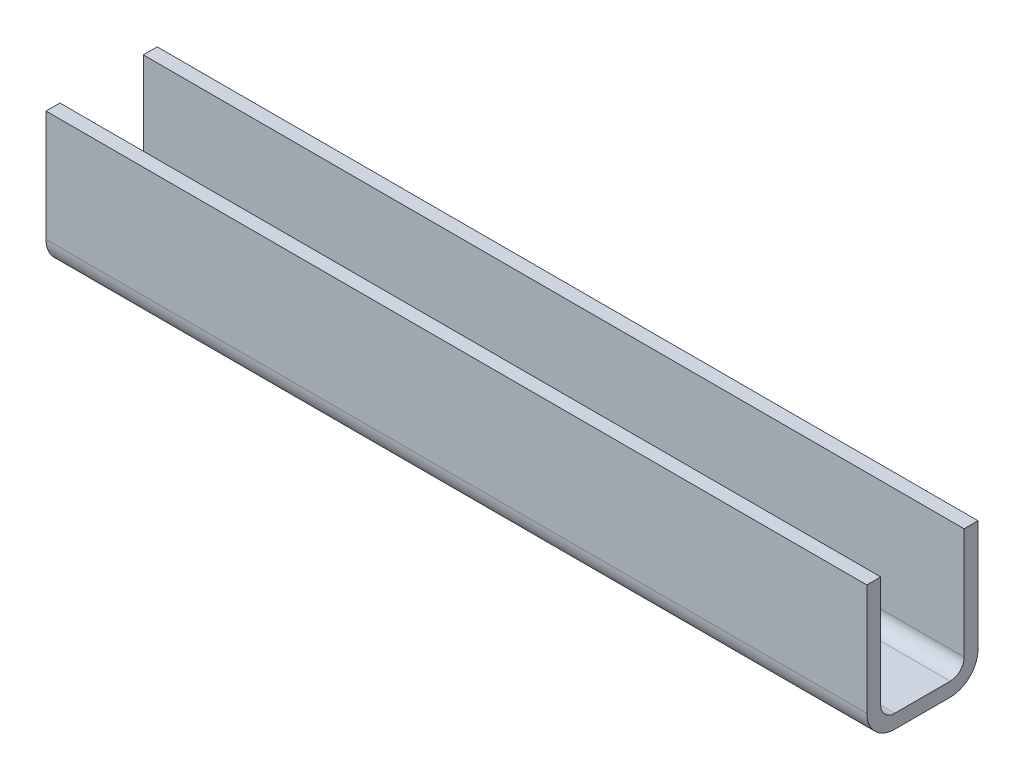
ISO-10303-21;
HEADER;
FILE_DESCRIPTION(('STEP AP214'),'2;1');
FILE_NAME('part.step','',(''),(''),'','','');
FILE_SCHEMA(('AUTOMOTIVE_DESIGN { 1 0 10303 214 1 1 1 1 }'));
ENDSEC;
DATA;
#1=APPLICATION_CONTEXT('core data for automotive mechanical design processes');
#2=APPLICATION_PROTOCOL_DEFINITION('international standard','automotive_design',2000,#1);
#3=PRODUCT_CONTEXT('',#1,'mechanical');
#4=PRODUCT('Part','Part','',(#3));
#5=PRODUCT_RELATED_PRODUCT_CATEGORY('part','',(#4));
#6=PRODUCT_DEFINITION_FORMATION('','',#4);
#7=PRODUCT_DEFINITION_CONTEXT('part definition',#1,'design');
#8=PRODUCT_DEFINITION('design','',#6,#7);
#9=PRODUCT_DEFINITION_SHAPE('','',#8);
#10=(LENGTH_UNIT() NAMED_UNIT(*) SI_UNIT(.MILLI.,.METRE.));
#11=(NAMED_UNIT(*) PLANE_ANGLE_UNIT() SI_UNIT($,.RADIAN.));
#12=(NAMED_UNIT(*) SI_UNIT($,.STERADIAN.) SOLID_ANGLE_UNIT());
#13=UNCERTAINTY_MEASURE_WITH_UNIT(LENGTH_MEASURE(1.E-05),#10,'distance_accuracy_value','');
#14=(GEOMETRIC_REPRESENTATION_CONTEXT(3) GLOBAL_UNCERTAINTY_ASSIGNED_CONTEXT((#13)) GLOBAL_UNIT_ASSIGNED_CONTEXT((#10,
#11,#12)) REPRESENTATION_CONTEXT('',''));
#15=CARTESIAN_POINT('',(0.,0.,0.));
#16=DIRECTION('',(0.,0.,1.));
#17=DIRECTION('',(1.,0.,0.));
#18=AXIS2_PLACEMENT_3D('',#15,#16,#17);
#19=CARTESIAN_POINT('',(375.,-25.4,25.399978));
#20=DIRECTION('',(0.,0.,-1.));
#21=DIRECTION('',(-1.,0.,0.));
#22=AXIS2_PLACEMENT_3D('',#19,#20,#21);
#23=PLANE('',#22);
#24=DIRECTION('',(0.,-1.,0.));
#25=VECTOR('',#24,1.);
#26=CARTESIAN_POINT('',(0.,-25.4,25.399978));
#27=LINE('',#26,#25);
#28=CARTESIAN_POINT('',(0.,25.4,25.399978));
#29=VERTEX_POINT('',#28);
#30=CARTESIAN_POINT('',(0.,-25.4,25.399978));
#31=VERTEX_POINT('',#30);
#32=EDGE_CURVE('E195',#29,#31,#27,.T.);
#33=ORIENTED_EDGE('',*,*,#32,.T.);
#34=DIRECTION('',(-1.,0.,0.));
#35=VECTOR('',#34,1.);
#36=CARTESIAN_POINT('',(375.,-25.4,25.399978));
#37=LINE('',#36,#35);
#38=CARTESIAN_POINT('',(375.,-25.4,25.399978));
#39=VERTEX_POINT('',#38);
#40=EDGE_CURVE('E168',#39,#31,#37,.T.);
#41=ORIENTED_EDGE('',*,*,#40,.F.);
#42=DIRECTION('',(0.,-1.,0.));
#43=VECTOR('',#42,1.);
#44=CARTESIAN_POINT('',(375.,-25.4,25.399978));
#45=LINE('',#44,#43);
#46=CARTESIAN_POINT('',(375.,25.4,25.399978));
#47=VERTEX_POINT('',#46);
#48=EDGE_CURVE('E156',#47,#39,#45,.T.);
#49=ORIENTED_EDGE('',*,*,#48,.F.);
#50=DIRECTION('',(-1.,0.,0.));
#51=VECTOR('',#50,1.);
#52=CARTESIAN_POINT('',(375.,25.4,25.399978));
#53=LINE('',#52,#51);
#54=EDGE_CURVE('E211',#47,#29,#53,.T.);
#55=ORIENTED_EDGE('',*,*,#54,.T.);
#56=EDGE_LOOP('',(#33,#41,#49,#55));
#57=FACE_BOUND('',#56,.T.);
#58=ADVANCED_FACE('F63',(#57),#23,.F.);
#59=CARTESIAN_POINT('',(375.,-25.4,12.699978));
#60=DIRECTION('',(-1.,0.,0.));
#61=DIRECTION('',(0.,0.,1.));
#62=AXIS2_PLACEMENT_3D('',#59,#60,#61);
#63=CYLINDRICAL_SURFACE('',#62,12.7);
#64=CARTESIAN_POINT('',(0.,-25.4,12.699978));
#65=DIRECTION('',(1.,0.,0.));
#66=DIRECTION('',(0.,0.,-1.));
#67=AXIS2_PLACEMENT_3D('',#64,#65,#66);
#68=CIRCLE('',#67,12.7);
#69=CARTESIAN_POINT('',(0.,-38.1,12.699978));
#70=VERTEX_POINT('',#69);
#71=EDGE_CURVE('E165',#31,#70,#68,.T.);
#72=ORIENTED_EDGE('',*,*,#71,.T.);
#73=DIRECTION('',(-1.,0.,0.));
#74=VECTOR('',#73,1.);
#75=CARTESIAN_POINT('',(375.,-38.1,12.699978));
#76=LINE('',#75,#74);
#77=CARTESIAN_POINT('',(375.,-38.1,12.699978));
#78=VERTEX_POINT('',#77);
#79=EDGE_CURVE('E162',#78,#70,#76,.T.);
#80=ORIENTED_EDGE('',*,*,#79,.F.);
#81=CARTESIAN_POINT('',(375.,-25.4,12.699978));
#82=DIRECTION('',(1.,0.,0.));
#83=DIRECTION('',(0.,0.,-1.));
#84=AXIS2_PLACEMENT_3D('',#81,#82,#83);
#85=CIRCLE('',#84,12.7);
#86=EDGE_CURVE('E148',#39,#78,#85,.T.);
#87=ORIENTED_EDGE('',*,*,#86,.F.);
#88=ORIENTED_EDGE('',*,*,#40,.T.);
#89=EDGE_LOOP('',(#72,#80,#87,#88));
#90=FACE_BOUND('',#89,.T.);
#91=ADVANCED_FACE('F163',(#90),#63,.T.);
#92=CARTESIAN_POINT('',(375.,-38.1,12.699978));
#93=DIRECTION('',(0.,1.,0.));
#94=DIRECTION('',(0.,0.,1.));
#95=AXIS2_PLACEMENT_3D('',#92,#93,#94);
#96=PLANE('',#95);
#97=DIRECTION('',(0.,0.,-1.));
#98=VECTOR('',#97,1.);
#99=CARTESIAN_POINT('',(0.,-38.1,12.699978));
#100=LINE('',#99,#98);
#101=CARTESIAN_POINT('',(0.,-38.1,-12.699978));
#102=VERTEX_POINT('',#101);
#103=EDGE_CURVE('E198',#70,#102,#100,.T.);
#104=ORIENTED_EDGE('',*,*,#103,.T.);
#105=DIRECTION('',(-1.,0.,0.));
#106=VECTOR('',#105,1.);
#107=CARTESIAN_POINT('',(375.,-38.1,-12.699978));
#108=LINE('',#107,#106);
#109=CARTESIAN_POINT('',(375.,-38.1,-12.699978));
#110=VERTEX_POINT('',#109);
#111=EDGE_CURVE('E169',#110,#102,#108,.T.);
#112=ORIENTED_EDGE('',*,*,#111,.F.);
#113=DIRECTION('',(0.,0.,-1.));
#114=VECTOR('',#113,1.);
#115=CARTESIAN_POINT('',(375.,-38.1,12.699978));
#116=LINE('',#115,#114);
#117=EDGE_CURVE('E153',#78,#110,#116,.T.);
#118=ORIENTED_EDGE('',*,*,#117,.F.);
#119=ORIENTED_EDGE('',*,*,#79,.T.);
#120=EDGE_LOOP('',(#104,#112,#118,#119));
#121=FACE_BOUND('',#120,.T.);
#122=ADVANCED_FACE('F171',(#121),#96,.F.);
#123=CARTESIAN_POINT('',(375.,-25.4,-12.699978));
#124=DIRECTION('',(-1.,0.,0.));
#125=DIRECTION('',(0.,0.,1.));
#126=AXIS2_PLACEMENT_3D('',#123,#124,#125);
#127=CYLINDRICAL_SURFACE('',#126,12.7);
#128=CARTESIAN_POINT('',(0.,-25.4,-12.699978));
#129=DIRECTION('',(1.,0.,0.));
#130=DIRECTION('',(0.,0.,-1.));
#131=AXIS2_PLACEMENT_3D('',#128,#129,#130);
#132=CIRCLE('',#131,12.7);
#133=CARTESIAN_POINT('',(0.,-25.4,-25.399978));
#134=VERTEX_POINT('',#133);
#135=EDGE_CURVE('E115',#102,#134,#132,.T.);
#136=ORIENTED_EDGE('',*,*,#135,.T.);
#137=DIRECTION('',(-1.,0.,0.));
#138=VECTOR('',#137,1.);
#139=CARTESIAN_POINT('',(375.,-25.4,-25.399978));
#140=LINE('',#139,#138);
#141=CARTESIAN_POINT('',(375.,-25.4,-25.399978));
#142=VERTEX_POINT('',#141);
#143=EDGE_CURVE('E206',#142,#134,#140,.T.);
#144=ORIENTED_EDGE('',*,*,#143,.F.);
#145=CARTESIAN_POINT('',(375.,-25.4,-12.699978));
#146=DIRECTION('',(1.,0.,0.));
#147=DIRECTION('',(0.,0.,-1.));
#148=AXIS2_PLACEMENT_3D('',#145,#146,#147);
#149=CIRCLE('',#148,12.7);
#150=EDGE_CURVE('E80',#110,#142,#149,.T.);
#151=ORIENTED_EDGE('',*,*,#150,.F.);
#152=ORIENTED_EDGE('',*,*,#111,.T.);
#153=EDGE_LOOP('',(#136,#144,#151,#152));
#154=FACE_BOUND('',#153,.T.);
#155=ADVANCED_FACE('F270',(#154),#127,.T.);
#156=CARTESIAN_POINT('',(375.,25.4,-19.049978));
#157=DIRECTION('',(0.,0.,1.));
#158=DIRECTION('',(1.,0.,0.));
#159=AXIS2_PLACEMENT_3D('',#156,#157,#158);
#160=PLANE('',#159);
#161=DIRECTION('',(0.,1.,0.));
#162=VECTOR('',#161,1.);
#163=CARTESIAN_POINT('',(0.,25.4,-19.049978));
#164=LINE('',#163,#162);
#165=CARTESIAN_POINT('',(0.,-25.4,-19.049978));
#166=VERTEX_POINT('',#165);
#167=CARTESIAN_POINT('',(0.,25.4,-19.049978));
#168=VERTEX_POINT('',#167);
#169=EDGE_CURVE('E179',#166,#168,#164,.T.);
#170=ORIENTED_EDGE('',*,*,#169,.F.);
#171=DIRECTION('',(-1.,0.,0.));
#172=VECTOR('',#171,1.);
#173=CARTESIAN_POINT('',(375.,-25.4,-19.049978));
#174=LINE('',#173,#172);
#175=CARTESIAN_POINT('',(375.,-25.4,-19.049978));
#176=VERTEX_POINT('',#175);
#177=EDGE_CURVE('E131',#176,#166,#174,.T.);
#178=ORIENTED_EDGE('',*,*,#177,.F.);
#179=DIRECTION('',(0.,1.,0.));
#180=VECTOR('',#179,1.);
#181=CARTESIAN_POINT('',(375.,25.4,-19.049978));
#182=LINE('',#181,#180);
#183=CARTESIAN_POINT('',(375.,25.4,-19.049978));
#184=VERTEX_POINT('',#183);
#185=EDGE_CURVE('E204',#176,#184,#182,.T.);
#186=ORIENTED_EDGE('',*,*,#185,.T.);
#187=DIRECTION('',(-1.,0.,0.));
#188=VECTOR('',#187,1.);
#189=CARTESIAN_POINT('',(375.,25.4,-19.049978));
#190=LINE('',#189,#188);
#191=EDGE_CURVE('E207',#184,#168,#190,.T.);
#192=ORIENTED_EDGE('',*,*,#191,.T.);
#193=EDGE_LOOP('',(#170,#178,#186,#192));
#194=FACE_BOUND('',#193,.T.);
#195=ADVANCED_FACE('F65',(#194),#160,.T.);
#196=CARTESIAN_POINT('',(375.,-25.4,-12.699978));
#197=DIRECTION('',(-1.,0.,0.));
#198=DIRECTION('',(0.,0.,1.));
#199=AXIS2_PLACEMENT_3D('',#196,#197,#198);
#200=CYLINDRICAL_SURFACE('',#199,6.35);
#201=CARTESIAN_POINT('',(0.,-25.4,-12.699978));
#202=DIRECTION('',(1.,0.,0.));
#203=DIRECTION('',(0.,0.,-1.));
#204=AXIS2_PLACEMENT_3D('',#201,#202,#203);
#205=CIRCLE('',#204,6.35);
#206=CARTESIAN_POINT('',(0.,-31.75,-12.699978));
#207=VERTEX_POINT('',#206);
#208=EDGE_CURVE('E182',#207,#166,#205,.T.);
#209=ORIENTED_EDGE('',*,*,#208,.F.);
#210=DIRECTION('',(-1.,0.,0.));
#211=VECTOR('',#210,1.);
#212=CARTESIAN_POINT('',(375.,-31.75,-12.699978));
#213=LINE('',#212,#211);
#214=CARTESIAN_POINT('',(375.,-31.75,-12.699978));
#215=VERTEX_POINT('',#214);
#216=EDGE_CURVE('E219',#215,#207,#213,.T.);
#217=ORIENTED_EDGE('',*,*,#216,.F.);
#218=CARTESIAN_POINT('',(375.,-25.4,-12.699978));
#219=DIRECTION('',(1.,0.,0.));
#220=DIRECTION('',(0.,0.,-1.));
#221=AXIS2_PLACEMENT_3D('',#218,#219,#220);
#222=CIRCLE('',#221,6.35);
#223=EDGE_CURVE('E236',#215,#176,#222,.T.);
#224=ORIENTED_EDGE('',*,*,#223,.T.);
#225=ORIENTED_EDGE('',*,*,#177,.T.);
#226=EDGE_LOOP('',(#209,#217,#224,#225));
#227=FACE_BOUND('',#226,.T.);
#228=ADVANCED_FACE('F233',(#227),#200,.F.);
#229=CARTESIAN_POINT('',(375.,-31.75,12.699978));
#230=DIRECTION('',(0.,1.,0.));
#231=DIRECTION('',(0.,0.,1.));
#232=AXIS2_PLACEMENT_3D('',#229,#230,#231);
#233=PLANE('',#232);
#234=DIRECTION('',(0.,0.,-1.));
#235=VECTOR('',#234,1.);
#236=CARTESIAN_POINT('',(0.,-31.75,12.699978));
#237=LINE('',#236,#235);
#238=CARTESIAN_POINT('',(0.,-31.75,12.699978));
#239=VERTEX_POINT('',#238);
#240=EDGE_CURVE('E186',#239,#207,#237,.T.);
#241=ORIENTED_EDGE('',*,*,#240,.F.);
#242=DIRECTION('',(-1.,0.,0.));
#243=VECTOR('',#242,1.);
#244=CARTESIAN_POINT('',(375.,-31.75,12.699978));
#245=LINE('',#244,#243);
#246=CARTESIAN_POINT('',(375.,-31.75,12.699978));
#247=VERTEX_POINT('',#246);
#248=EDGE_CURVE('E217',#247,#239,#245,.T.);
#249=ORIENTED_EDGE('',*,*,#248,.F.);
#250=DIRECTION('',(0.,0.,-1.));
#251=VECTOR('',#250,1.);
#252=CARTESIAN_POINT('',(375.,-31.75,12.699978));
#253=LINE('',#252,#251);
#254=EDGE_CURVE('E239',#247,#215,#253,.T.);
#255=ORIENTED_EDGE('',*,*,#254,.T.);
#256=ORIENTED_EDGE('',*,*,#216,.T.);
#257=EDGE_LOOP('',(#241,#249,#255,#256));
#258=FACE_BOUND('',#257,.T.);
#259=ADVANCED_FACE('F297',(#258),#233,.T.);
#260=CARTESIAN_POINT('',(375.,-25.4,12.699978));
#261=DIRECTION('',(-1.,0.,0.));
#262=DIRECTION('',(0.,0.,1.));
#263=AXIS2_PLACEMENT_3D('',#260,#261,#262);
#264=CYLINDRICAL_SURFACE('',#263,6.35);
#265=CARTESIAN_POINT('',(0.,-25.4,12.699978));
#266=DIRECTION('',(1.,0.,0.));
#267=DIRECTION('',(0.,0.,-1.));
#268=AXIS2_PLACEMENT_3D('',#265,#266,#267);
#269=CIRCLE('',#268,6.35);
#270=CARTESIAN_POINT('',(0.,-25.4,19.049978));
#271=VERTEX_POINT('',#270);
#272=EDGE_CURVE('E189',#271,#239,#269,.T.);
#273=ORIENTED_EDGE('',*,*,#272,.F.);
#274=DIRECTION('',(-1.,0.,0.));
#275=VECTOR('',#274,1.);
#276=CARTESIAN_POINT('',(375.,-25.4,19.049978));
#277=LINE('',#276,#275);
#278=CARTESIAN_POINT('',(375.,-25.4,19.049978));
#279=VERTEX_POINT('',#278);
#280=EDGE_CURVE('E215',#279,#271,#277,.T.);
#281=ORIENTED_EDGE('',*,*,#280,.F.);
#282=CARTESIAN_POINT('',(375.,-25.4,12.699978));
#283=DIRECTION('',(1.,0.,0.));
#284=DIRECTION('',(0.,0.,-1.));
#285=AXIS2_PLACEMENT_3D('',#282,#283,#284);
#286=CIRCLE('',#285,6.35);
#287=EDGE_CURVE('E241',#279,#247,#286,.T.);
#288=ORIENTED_EDGE('',*,*,#287,.T.);
#289=ORIENTED_EDGE('',*,*,#248,.T.);
#290=EDGE_LOOP('',(#273,#281,#288,#289));
#291=FACE_BOUND('',#290,.T.);
#292=ADVANCED_FACE('F294',(#291),#264,.F.);
#293=CARTESIAN_POINT('',(375.,-25.4,19.049978));
#294=DIRECTION('',(0.,0.,-1.));
#295=DIRECTION('',(-1.,0.,0.));
#296=AXIS2_PLACEMENT_3D('',#293,#294,#295);
#297=PLANE('',#296);
#298=DIRECTION('',(0.,-1.,0.));
#299=VECTOR('',#298,1.);
#300=CARTESIAN_POINT('',(0.,-25.4,19.049978));
#301=LINE('',#300,#299);
#302=CARTESIAN_POINT('',(0.,25.4,19.049978));
#303=VERTEX_POINT('',#302);
#304=EDGE_CURVE('E192',#303,#271,#301,.T.);
#305=ORIENTED_EDGE('',*,*,#304,.F.);
#306=DIRECTION('',(-1.,0.,0.));
#307=VECTOR('',#306,1.);
#308=CARTESIAN_POINT('',(375.,25.4,19.049978));
#309=LINE('',#308,#307);
#310=CARTESIAN_POINT('',(375.,25.4,19.049978));
#311=VERTEX_POINT('',#310);
#312=EDGE_CURVE('E178',#311,#303,#309,.T.);
#313=ORIENTED_EDGE('',*,*,#312,.F.);
#314=DIRECTION('',(0.,-1.,0.));
#315=VECTOR('',#314,1.);
#316=CARTESIAN_POINT('',(375.,-25.4,19.049978));
#317=LINE('',#316,#315);
#318=EDGE_CURVE('E248',#311,#279,#317,.T.);
#319=ORIENTED_EDGE('',*,*,#318,.T.);
#320=ORIENTED_EDGE('',*,*,#280,.T.);
#321=EDGE_LOOP('',(#305,#313,#319,#320));
#322=FACE_BOUND('',#321,.T.);
#323=ADVANCED_FACE('F254',(#322),#297,.T.);
#324=CARTESIAN_POINT('',(375.,25.4,-25.399978));
#325=DIRECTION('',(0.,0.,1.));
#326=DIRECTION('',(1.,0.,0.));
#327=AXIS2_PLACEMENT_3D('',#324,#325,#326);
#328=PLANE('',#327);
#329=DIRECTION('',(0.,1.,0.));
#330=VECTOR('',#329,1.);
#331=CARTESIAN_POINT('',(0.,25.4,-25.399978));
#332=LINE('',#331,#330);
#333=CARTESIAN_POINT('',(0.,25.4,-25.399978));
#334=VERTEX_POINT('',#333);
#335=EDGE_CURVE('E201',#134,#334,#332,.T.);
#336=ORIENTED_EDGE('',*,*,#335,.T.);
#337=DIRECTION('',(-1.,0.,0.));
#338=VECTOR('',#337,1.);
#339=CARTESIAN_POINT('',(375.,25.4,-25.399978));
#340=LINE('',#339,#338);
#341=CARTESIAN_POINT('',(375.,25.4,-25.399978));
#342=VERTEX_POINT('',#341);
#343=EDGE_CURVE('E123',#342,#334,#340,.T.);
#344=ORIENTED_EDGE('',*,*,#343,.F.);
#345=DIRECTION('',(0.,1.,0.));
#346=VECTOR('',#345,1.);
#347=CARTESIAN_POINT('',(375.,25.4,-25.399978));
#348=LINE('',#347,#346);
#349=EDGE_CURVE('E173',#142,#342,#348,.T.);
#350=ORIENTED_EDGE('',*,*,#349,.F.);
#351=ORIENTED_EDGE('',*,*,#143,.T.);
#352=EDGE_LOOP('',(#336,#344,#350,#351));
#353=FACE_BOUND('',#352,.T.);
#354=ADVANCED_FACE('F273',(#353),#328,.F.);
#355=CARTESIAN_POINT('',(375.,25.4,-12.699978));
#356=DIRECTION('',(1.,0.,0.));
#357=DIRECTION('',(0.,0.,-1.));
#358=AXIS2_PLACEMENT_3D('',#355,#356,#357);
#359=PLANE('',#358);
#360=DIRECTION('',(0.,0.,-1.));
#361=VECTOR('',#360,1.);
#362=CARTESIAN_POINT('',(375.,25.4,52.600022));
#363=LINE('',#362,#361);
#364=EDGE_CURVE('E183',#47,#311,#363,.T.);
#365=ORIENTED_EDGE('',*,*,#364,.F.);
#366=ORIENTED_EDGE('',*,*,#48,.T.);
#367=ORIENTED_EDGE('',*,*,#86,.T.);
#368=ORIENTED_EDGE('',*,*,#117,.T.);
#369=ORIENTED_EDGE('',*,*,#150,.T.);
#370=ORIENTED_EDGE('',*,*,#349,.T.);
#371=EDGE_CURVE('E274',#184,#342,#363,.T.);
#372=ORIENTED_EDGE('',*,*,#371,.F.);
#373=ORIENTED_EDGE('',*,*,#185,.F.);
#374=ORIENTED_EDGE('',*,*,#223,.F.);
#375=ORIENTED_EDGE('',*,*,#254,.F.);
#376=ORIENTED_EDGE('',*,*,#287,.F.);
#377=ORIENTED_EDGE('',*,*,#318,.F.);
#378=EDGE_LOOP('',(#365,#366,#367,#368,#369,#370,#372,#373,#374,#375,#376,#377));
#379=FACE_BOUND('',#378,.T.);
#380=ADVANCED_FACE('F151',(#379),#359,.T.);
#381=CARTESIAN_POINT('',(0.,25.4,-12.699978));
#382=DIRECTION('',(1.,0.,0.));
#383=DIRECTION('',(0.,0.,-1.));
#384=AXIS2_PLACEMENT_3D('',#381,#382,#383);
#385=PLANE('',#384);
#386=ORIENTED_EDGE('',*,*,#32,.F.);
#387=DIRECTION('',(0.,0.,-1.));
#388=VECTOR('',#387,1.);
#389=CARTESIAN_POINT('',(0.,25.4,-12.699978));
#390=LINE('',#389,#388);
#391=EDGE_CURVE('E12',#29,#303,#390,.T.);
#392=ORIENTED_EDGE('',*,*,#391,.T.);
#393=ORIENTED_EDGE('',*,*,#304,.T.);
#394=ORIENTED_EDGE('',*,*,#272,.T.);
#395=ORIENTED_EDGE('',*,*,#240,.T.);
#396=ORIENTED_EDGE('',*,*,#208,.T.);
#397=ORIENTED_EDGE('',*,*,#169,.T.);
#398=EDGE_CURVE('E67',#168,#334,#390,.T.);
#399=ORIENTED_EDGE('',*,*,#398,.T.);
#400=ORIENTED_EDGE('',*,*,#335,.F.);
#401=ORIENTED_EDGE('',*,*,#135,.F.);
#402=ORIENTED_EDGE('',*,*,#103,.F.);
#403=ORIENTED_EDGE('',*,*,#71,.F.);
#404=EDGE_LOOP('',(#386,#392,#393,#394,#395,#396,#397,#399,#400,#401,#402,#403));
#405=FACE_BOUND('',#404,.T.);
#406=ADVANCED_FACE('F228',(#405),#385,.F.);
#407=CARTESIAN_POINT('',(375.,25.4,52.600022));
#408=DIRECTION('',(0.,-1.,0.));
#409=DIRECTION('',(1.,0.,0.));
#410=AXIS2_PLACEMENT_3D('',#407,#408,#409);
#411=PLANE('',#410);
#412=ORIENTED_EDGE('',*,*,#191,.F.);
#413=ORIENTED_EDGE('',*,*,#371,.T.);
#414=ORIENTED_EDGE('',*,*,#343,.T.);
#415=ORIENTED_EDGE('',*,*,#398,.F.);
#416=EDGE_LOOP('',(#412,#413,#414,#415));
#417=FACE_BOUND('',#416,.T.);
#418=ADVANCED_FACE('F275',(#417),#411,.F.);
#419=ORIENTED_EDGE('',*,*,#364,.T.);
#420=ORIENTED_EDGE('',*,*,#312,.T.);
#421=ORIENTED_EDGE('',*,*,#391,.F.);
#422=ORIENTED_EDGE('',*,*,#54,.F.);
#423=EDGE_LOOP('',(#419,#420,#421,#422));
#424=FACE_BOUND('',#423,.T.);
#425=ADVANCED_FACE('F268',(#424),#411,.F.);
#426=CLOSED_SHELL('',(#58,#91,#122,#155,#195,#228,#259,#292,#323,#354,#380,#406,#418,#425));
#427=MANIFOLD_SOLID_BREP('B2',#426);
#428=ADVANCED_BREP_SHAPE_REPRESENTATION('',(#18,#427),#14);
#429=SHAPE_DEFINITION_REPRESENTATION(#9,#428);
ENDSEC;
END-ISO-10303-21;
